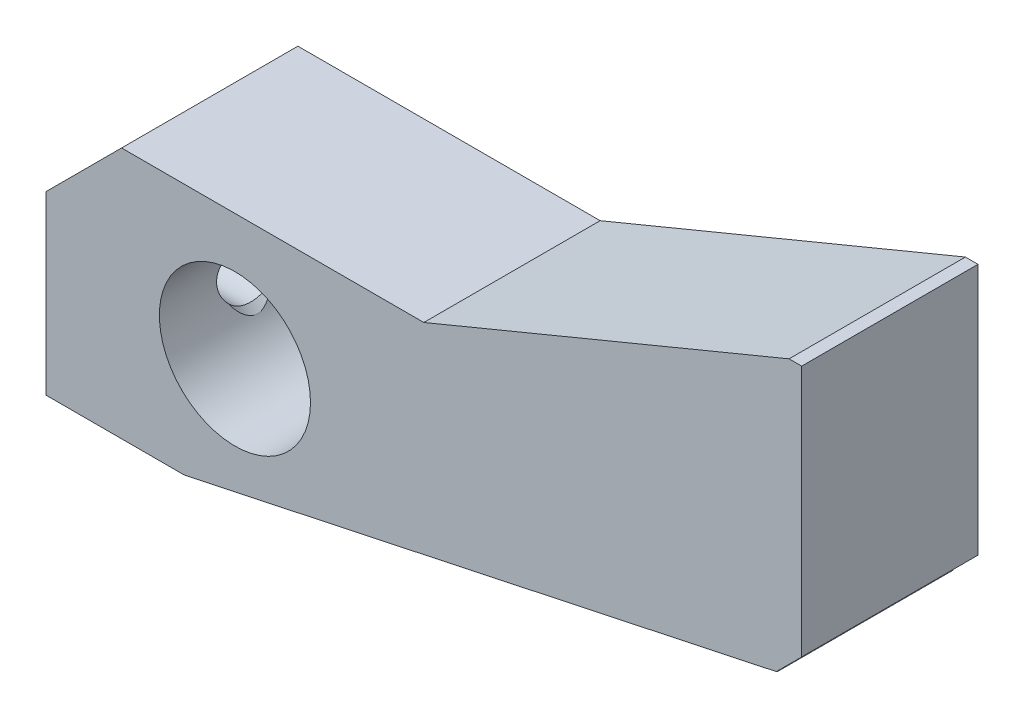
ISO-10303-21;
HEADER;
FILE_DESCRIPTION(('STEP AP214'),'2;1');
FILE_NAME('part.step','',(''),(''),'','','');
FILE_SCHEMA(('AUTOMOTIVE_DESIGN { 1 0 10303 214 1 1 1 1 }'));
ENDSEC;
DATA;
#1=APPLICATION_CONTEXT('core data for automotive mechanical design processes');
#2=APPLICATION_PROTOCOL_DEFINITION('international standard','automotive_design',2000,#1);
#3=PRODUCT_CONTEXT('',#1,'mechanical');
#4=PRODUCT('Part','Part','',(#3));
#5=PRODUCT_RELATED_PRODUCT_CATEGORY('part','',(#4));
#6=PRODUCT_DEFINITION_FORMATION('','',#4);
#7=PRODUCT_DEFINITION_CONTEXT('part definition',#1,'design');
#8=PRODUCT_DEFINITION('design','',#6,#7);
#9=PRODUCT_DEFINITION_SHAPE('','',#8);
#10=(LENGTH_UNIT() NAMED_UNIT(*) SI_UNIT(.MILLI.,.METRE.));
#11=(NAMED_UNIT(*) PLANE_ANGLE_UNIT() SI_UNIT($,.RADIAN.));
#12=(NAMED_UNIT(*) SI_UNIT($,.STERADIAN.) SOLID_ANGLE_UNIT());
#13=UNCERTAINTY_MEASURE_WITH_UNIT(LENGTH_MEASURE(1.E-05),#10,'distance_accuracy_value','');
#14=(GEOMETRIC_REPRESENTATION_CONTEXT(3) GLOBAL_UNCERTAINTY_ASSIGNED_CONTEXT((#13)) GLOBAL_UNIT_ASSIGNED_CONTEXT((#10,
#11,#12)) REPRESENTATION_CONTEXT('',''));
#15=CARTESIAN_POINT('',(0.,0.,0.));
#16=DIRECTION('',(0.,0.,1.));
#17=DIRECTION('',(1.,0.,0.));
#18=AXIS2_PLACEMENT_3D('',#15,#16,#17);
#19=CARTESIAN_POINT('',(7.5,23.,3.5));
#20=DIRECTION('',(0.,0.,-1.));
#21=DIRECTION('',(-1.,0.,0.));
#22=AXIS2_PLACEMENT_3D('',#19,#20,#21);
#23=CYLINDRICAL_SURFACE('',#22,3.);
#24=CARTESIAN_POINT('',(7.5,23.,3.5));
#25=DIRECTION('',(0.,0.,1.));
#26=DIRECTION('',(1.,0.,0.));
#27=AXIS2_PLACEMENT_3D('',#24,#25,#26);
#28=CIRCLE('',#27,3.);
#29=CARTESIAN_POINT('',(10.5,23.,3.5));
#30=VERTEX_POINT('',#29);
#31=EDGE_CURVE('E242',#30,#30,#28,.T.);
#32=ORIENTED_EDGE('',*,*,#31,.T.);
#33=EDGE_LOOP('',(#32));
#34=FACE_BOUND('',#33,.T.);
#35=CARTESIAN_POINT('',(7.5,23.,-3.5));
#36=DIRECTION('',(0.,0.,1.));
#37=DIRECTION('',(1.,0.,0.));
#38=AXIS2_PLACEMENT_3D('',#35,#36,#37);
#39=CIRCLE('',#38,3.);
#40=CARTESIAN_POINT('',(10.5,23.,-3.5));
#41=VERTEX_POINT('',#40);
#42=EDGE_CURVE('E137',#41,#41,#39,.T.);
#43=ORIENTED_EDGE('',*,*,#42,.F.);
#44=EDGE_LOOP('',(#43));
#45=FACE_BOUND('',#44,.T.);
#46=CARTESIAN_POINT('',(4.6041737886467,22.2162968970081,-0.911709662590456));
#47=CARTESIAN_POINT('',(4.61561035443615,22.1740121646667,-0.890437308156216));
#48=CARTESIAN_POINT('',(4.62777976627562,22.1327435841244,-0.867544293755267));
#49=CARTESIAN_POINT('',(4.65326943203076,22.052428132703,-0.818553624243152));
#50=CARTESIAN_POINT('',(4.6665915624406,22.0133850627965,-0.792450713553859));
#51=CARTESIAN_POINT('',(4.69418679658169,21.9374249658215,-0.736835309920441));
#52=CARTESIAN_POINT('',(4.70846895169041,21.9005369784616,-0.707287593652195));
#53=CARTESIAN_POINT('',(4.73739220776841,21.8297622128398,-0.645004540393534));
#54=CARTESIAN_POINT('',(4.75203296387119,21.7958726852927,-0.612272182461936));
#55=CARTESIAN_POINT('',(4.78147097347512,21.7307851376176,-0.542545419442342));
#56=CARTESIAN_POINT('',(4.79626280289275,21.6996769959314,-0.505464082449305));
#57=CARTESIAN_POINT('',(4.82467389714939,21.6421886882559,-0.427441648137738));
#58=CARTESIAN_POINT('',(4.83829582880437,21.6157976124887,-0.386509800357217));
#59=CARTESIAN_POINT('',(4.86008905224707,21.5747697156954,-0.310307068318638));
#60=CARTESIAN_POINT('',(4.86879303526547,21.558825675972,-0.275905168252087));
#61=CARTESIAN_POINT('',(4.88367474394825,21.5319810348952,-0.204673165274961));
#62=CARTESIAN_POINT('',(4.88985839417165,21.5210685977,-0.167848996067642));
#63=CARTESIAN_POINT('',(4.89787304701743,21.5070198254119,-0.0992698954484695));
#64=CARTESIAN_POINT('',(4.90028930554651,21.5028335014439,-0.0678038647716034));
#65=CARTESIAN_POINT('',(4.90236837955414,21.4992283970243,-0.00450936919528316));
#66=CARTESIAN_POINT('',(4.90203260692705,21.4998071719003,0.0273189014925282));
#67=CARTESIAN_POINT('',(4.89867009581343,21.5056465146143,0.0902949531264951));
#68=CARTESIAN_POINT('',(4.89565027539462,21.5108950463038,0.121444272721741));
#69=CARTESIAN_POINT('',(4.88736790271108,21.52547530725,0.182458333808734));
#70=CARTESIAN_POINT('',(4.88210266250033,21.5348119306364,0.212321488333723));
#71=CARTESIAN_POINT('',(4.86624474110431,21.5634305030651,0.28789738946331));
#72=CARTESIAN_POINT('',(4.8543525829973,21.5853165502174,0.33233904799125));
#73=CARTESIAN_POINT('',(4.82832684139246,21.6350967975101,0.417041314302471));
#74=CARTESIAN_POINT('',(4.81418461772468,21.6630143125327,0.457284772431448));
#75=CARTESIAN_POINT('',(4.77505897504597,21.743875805831,0.560178869743622));
#76=CARTESIAN_POINT('',(4.74927731935339,21.80087555344,0.619325510294756));
#77=CARTESIAN_POINT('',(4.69892340683024,21.9237069467362,0.72792308916227));
#78=CARTESIAN_POINT('',(4.67435068501032,21.9895351598729,0.777377777455286));
#79=CARTESIAN_POINT('',(4.64304628650006,22.0842863218241,0.838265690284918));
#80=CARTESIAN_POINT('',(4.63489242848784,22.1101056101497,0.853903872742624));
#81=CARTESIAN_POINT('',(4.61912042442353,22.1625751615868,0.883818247801013));
#82=CARTESIAN_POINT('',(4.6115008125624,22.1892228361823,0.898098208736462));
#83=CARTESIAN_POINT('',(4.6041737886467,22.2162968970081,0.911709662590457));
#84=B_SPLINE_CURVE_WITH_KNOTS('',3,(#46,#47,#48,#49,#50,#51,#52,#53,#54,#55,#56,#57,#58,#59,#60,
#61,#62,#63,#64,#65,#66,#67,#68,#69,#70,#71,#72,#73,#74,#75,#76,#77,#78,#79,#80,#81,#82,#83),
.UNSPECIFIED.,.F.,.F.,(4,2,2,2,2,2,2,2,2,2,2,2,2,2,2,2,2,2,4),(0.,0.146042119765071,
0.292326620834533,0.440265596049056,0.588067489177065,0.739611820685571,0.89080098779241,
1.007151161269,1.12322623008572,1.21829120325993,1.31330740762055,1.40807941794629,
1.50296519777145,1.65492506347748,1.80748319561722,2.06440215102411,2.32122150312435,
2.4149884981416,2.50848724897311),.UNSPECIFIED.);
#85=CARTESIAN_POINT('',(4.6314237886467,22.1217799138838,-0.860464833878788));
#86=VERTEX_POINT('',#85);
#87=CARTESIAN_POINT('',(4.6314237886467,22.1217799138838,0.860464833878788));
#88=VERTEX_POINT('',#87);
#89=EDGE_CURVE('E132',#86,#88,#84,.T.);
#90=ORIENTED_EDGE('',*,*,#89,.T.);
#91=CARTESIAN_POINT('',(4.6314237886467,22.1217799138838,0.860464833878788));
#92=CARTESIAN_POINT('',(4.61679684502925,22.1694296785405,0.909143753780978));
#93=CARTESIAN_POINT('',(4.60227727565843,22.2212145743478,0.953862536992754));
#94=CARTESIAN_POINT('',(4.57479980097877,22.331868584207,1.03438105606352));
#95=CARTESIAN_POINT('',(4.56184579496756,22.3907546854609,1.07015874981223));
#96=CARTESIAN_POINT('',(4.53890734778454,22.5143085241053,1.13161200365721));
#97=CARTESIAN_POINT('',(4.52892917135664,22.5789880911334,1.15726628801592));
#98=CARTESIAN_POINT('',(4.51309299584847,22.7121394275163,1.19734213641833));
#99=CARTESIAN_POINT('',(4.50722891348275,22.7806054356485,1.2117802885481));
#100=CARTESIAN_POINT('',(4.50045884641195,22.9157403646578,1.22840153249424));
#101=CARTESIAN_POINT('',(4.49931818644367,22.9823263144167,1.23116481981088));
#102=CARTESIAN_POINT('',(4.5014712897722,23.1150034920026,1.22590821709604));
#103=CARTESIAN_POINT('',(4.50476520635264,23.1810947026491,1.21788795432514));
#104=CARTESIAN_POINT('',(4.51524974660488,23.3085820040413,1.19186359028077));
#105=CARTESIAN_POINT('',(4.52230433517397,23.3700613144474,1.17420754478143));
#106=CARTESIAN_POINT('',(4.53954116712073,23.4891948576273,1.12978026633704));
#107=CARTESIAN_POINT('',(4.54972524174725,23.5468468267125,1.10300369543138));
#108=CARTESIAN_POINT('',(4.57145559791989,23.6529459422296,1.04343515557052));
#109=CARTESIAN_POINT('',(4.5828463171941,23.7017582994895,1.01123144465478));
#110=CARTESIAN_POINT('',(4.60661166069776,23.794103095026,0.940454921701907));
#111=CARTESIAN_POINT('',(4.61898431797601,23.8376456683954,0.901894683591802));
#112=CARTESIAN_POINT('',(4.6314237886467,23.8782200861162,0.860464833878787));
#113=B_SPLINE_CURVE_WITH_KNOTS('',3,(#91,#92,#93,#94,#95,#96,#97,#98,#99,#100,#101,#102,#103,
#104,#105,#106,#107,#108,#109,#110,#111,#112),.UNSPECIFIED.,.F.,.F.,(4,2,2,2,2,2,2,2,2,2,4),(0.,
0.20885179204027,0.418213488667532,0.628012873726244,0.837501382362083,1.03644688269537,
1.23539925986755,1.427599844071,1.61991311115374,1.79806290742298,1.97586444138595),.UNSPECIFIED.);
#114=CARTESIAN_POINT('',(4.6314237886467,23.8782200861162,0.860464833878788));
#115=VERTEX_POINT('',#114);
#116=EDGE_CURVE('E11',#88,#115,#113,.T.);
#117=ORIENTED_EDGE('',*,*,#116,.T.);
#118=CARTESIAN_POINT('',(4.6041737886467,23.7837031029919,0.911709662590456));
#119=CARTESIAN_POINT('',(4.61561035443615,23.8259878353333,0.890437308156215));
#120=CARTESIAN_POINT('',(4.62777976627562,23.8672564158756,0.867544293755266));
#121=CARTESIAN_POINT('',(4.65326943203076,23.947571867297,0.818553624243152));
#122=CARTESIAN_POINT('',(4.6665915624406,23.9866149372035,0.792450713553859));
#123=CARTESIAN_POINT('',(4.69418679658169,24.0625750341785,0.736835309920441));
#124=CARTESIAN_POINT('',(4.70846895169041,24.0994630215384,0.707287593652193));
#125=CARTESIAN_POINT('',(4.73739220776841,24.1702377871602,0.645004540393532));
#126=CARTESIAN_POINT('',(4.75203296387119,24.2041273147073,0.612272182461935));
#127=CARTESIAN_POINT('',(4.78147097347512,24.2692148623824,0.542545419442342));
#128=CARTESIAN_POINT('',(4.79626280289275,24.3003230040686,0.505464082449305));
#129=CARTESIAN_POINT('',(4.82467389714939,24.3578113117441,0.427441648137738));
#130=CARTESIAN_POINT('',(4.83829582880437,24.3842023875113,0.386509800357216));
#131=CARTESIAN_POINT('',(4.86008905224707,24.4252302843046,0.310307068318638));
#132=CARTESIAN_POINT('',(4.86879303526547,24.441174324028,0.275905168252088));
#133=CARTESIAN_POINT('',(4.88367474394825,24.4680189651048,0.204673165274962));
#134=CARTESIAN_POINT('',(4.88985839417165,24.4789314023,0.167848996067643));
#135=CARTESIAN_POINT('',(4.89787304701743,24.4929801745881,0.0992698954484706));
#136=CARTESIAN_POINT('',(4.90028930554651,24.4971664985561,0.0678038647716046));
#137=CARTESIAN_POINT('',(4.90236837955414,24.5007716029757,0.00450936919528443));
#138=CARTESIAN_POINT('',(4.90203260692705,24.5001928280997,-0.027318901492527));
#139=CARTESIAN_POINT('',(4.89867009581343,24.4943534853857,-0.0902949531264939));
#140=CARTESIAN_POINT('',(4.89565027539462,24.4891049536962,-0.12144427272174));
#141=CARTESIAN_POINT('',(4.88736790271108,24.47452469275,-0.182458333808733));
#142=CARTESIAN_POINT('',(4.88210266250033,24.4651880693636,-0.212321488333722));
#143=CARTESIAN_POINT('',(4.86624474110431,24.4365694969349,-0.287897389463308));
#144=CARTESIAN_POINT('',(4.85435258299731,24.4146834497826,-0.332339047991247));
#145=CARTESIAN_POINT('',(4.82832684139246,24.3649032024899,-0.417041314302468));
#146=CARTESIAN_POINT('',(4.81418461772468,24.3369856874673,-0.457284772431447));
#147=CARTESIAN_POINT('',(4.77505897504597,24.256124194169,-0.560178869743623));
#148=CARTESIAN_POINT('',(4.74927731935339,24.19912444656,-0.619325510294757));
#149=CARTESIAN_POINT('',(4.69892340683024,24.0762930532638,-0.72792308916227));
#150=CARTESIAN_POINT('',(4.67435068501032,24.0104648401271,-0.777377777455285));
#151=CARTESIAN_POINT('',(4.64304628650006,23.9157136781759,-0.838265690284916));
#152=CARTESIAN_POINT('',(4.63489242848784,23.8898943898503,-0.853903872742622));
#153=CARTESIAN_POINT('',(4.61912042442353,23.8374248384132,-0.883818247801011));
#154=CARTESIAN_POINT('',(4.6115008125624,23.8107771638177,-0.898098208736461));
#155=CARTESIAN_POINT('',(4.6041737886467,23.7837031029919,-0.911709662590456));
#156=B_SPLINE_CURVE_WITH_KNOTS('',3,(#118,#119,#120,#121,#122,#123,#124,#125,#126,#127,#128,
#129,#130,#131,#132,#133,#134,#135,#136,#137,#138,#139,#140,#141,#142,#143,#144,#145,#146,#147,
#148,#149,#150,#151,#152,#153,#154,#155),.UNSPECIFIED.,.F.,.F.,(4,2,2,2,2,2,2,2,2,2,2,2,2,2,2,2,
2,2,4),(0.,0.146042119765071,0.292326620834533,0.440265596049057,0.588067489177064,
0.739611820685571,0.890800987792409,1.007151161269,1.12322623008572,1.21829120325993,
1.31330740762055,1.40807941794629,1.50296519777145,1.65492506347748,1.80748319561721,
2.06440215102411,2.32122150312434,2.41498849814159,2.50848724897311),.UNSPECIFIED.);
#157=CARTESIAN_POINT('',(4.6314237886467,23.8782200861162,-0.860464833878788));
#158=VERTEX_POINT('',#157);
#159=EDGE_CURVE('E43',#115,#158,#156,.T.);
#160=ORIENTED_EDGE('',*,*,#159,.T.);
#161=CARTESIAN_POINT('',(4.6314237886467,23.8782200861162,-0.860464833878788));
#162=CARTESIAN_POINT('',(4.61679684502925,23.8305703214595,-0.909143753780978));
#163=CARTESIAN_POINT('',(4.60227727565843,23.7787854256522,-0.953862536992754));
#164=CARTESIAN_POINT('',(4.57479980097877,23.668131415793,-1.03438105606352));
#165=CARTESIAN_POINT('',(4.56184579496756,23.6092453145391,-1.07015874981223));
#166=CARTESIAN_POINT('',(4.53890734778454,23.4856914758947,-1.13161200365721));
#167=CARTESIAN_POINT('',(4.52892917135664,23.4210119088666,-1.15726628801592));
#168=CARTESIAN_POINT('',(4.51309299584847,23.2878605724837,-1.19734213641833));
#169=CARTESIAN_POINT('',(4.50722891348275,23.2193945643515,-1.2117802885481));
#170=CARTESIAN_POINT('',(4.50045884641195,23.0842596353422,-1.22840153249424));
#171=CARTESIAN_POINT('',(4.49931818644367,23.0176736855833,-1.23116481981088));
#172=CARTESIAN_POINT('',(4.5014712897722,22.8849965079974,-1.22590821709604));
#173=CARTESIAN_POINT('',(4.50476520635264,22.8189052973509,-1.21788795432514));
#174=CARTESIAN_POINT('',(4.51524974660488,22.6914179959587,-1.19186359028077));
#175=CARTESIAN_POINT('',(4.52230433517397,22.6299386855526,-1.17420754478143));
#176=CARTESIAN_POINT('',(4.53954116712073,22.5108051423727,-1.12978026633704));
#177=CARTESIAN_POINT('',(4.54972524174725,22.4531531732875,-1.10300369543138));
#178=CARTESIAN_POINT('',(4.57145559791989,22.3470540577704,-1.04343515557052));
#179=CARTESIAN_POINT('',(4.5828463171941,22.2982417005105,-1.01123144465478));
#180=CARTESIAN_POINT('',(4.60661166069776,22.205896904974,-0.940454921701907));
#181=CARTESIAN_POINT('',(4.61898431797601,22.1623543316046,-0.901894683591802));
#182=CARTESIAN_POINT('',(4.6314237886467,22.1217799138838,-0.860464833878787));
#183=B_SPLINE_CURVE_WITH_KNOTS('',3,(#161,#162,#163,#164,#165,#166,#167,#168,#169,#170,#171,
#172,#173,#174,#175,#176,#177,#178,#179,#180,#181,#182),.UNSPECIFIED.,.F.,.F.,(4,2,2,2,2,2,2,2,
2,2,4),(0.,0.20885179204027,0.418213488667532,0.628012873726248,0.837501382362083,
1.03644688269537,1.23539925986755,1.427599844071,1.61991311115374,1.79806290742298,
1.97586444138595),.UNSPECIFIED.);
#184=EDGE_CURVE('E125',#158,#86,#183,.T.);
#185=ORIENTED_EDGE('',*,*,#184,.T.);
#186=EDGE_LOOP('',(#90,#117,#160,#185));
#187=FACE_BOUND('',#186,.T.);
#188=ADVANCED_FACE('F34',(#34,#45,#187),#23,.F.);
#189=CARTESIAN_POINT('',(3.,28.,3.5));
#190=DIRECTION('',(0.707106781186547,-0.707106781186548,0.));
#191=DIRECTION('',(0.707106781186548,0.707106781186547,0.));
#192=AXIS2_PLACEMENT_3D('',#189,#190,#191);
#193=PLANE('',#192);
#194=DIRECTION('',(0.,0.,-1.));
#195=VECTOR('',#194,1.);
#196=CARTESIAN_POINT('',(3.,28.,3.5));
#197=LINE('',#196,#195);
#198=CARTESIAN_POINT('',(3.,28.,3.5));
#199=VERTEX_POINT('',#198);
#200=CARTESIAN_POINT('',(3.,28.,-3.5));
#201=VERTEX_POINT('',#200);
#202=EDGE_CURVE('E191',#199,#201,#197,.T.);
#203=ORIENTED_EDGE('',*,*,#202,.T.);
#204=DIRECTION('',(-0.707106781186548,-0.707106781186547,0.));
#205=VECTOR('',#204,1.);
#206=CARTESIAN_POINT('',(3.,28.,-3.5));
#207=LINE('',#206,#205);
#208=CARTESIAN_POINT('',(0.,25.,-3.5));
#209=VERTEX_POINT('',#208);
#210=EDGE_CURVE('E239',#201,#209,#207,.T.);
#211=ORIENTED_EDGE('',*,*,#210,.T.);
#212=DIRECTION('',(0.,0.,-1.));
#213=VECTOR('',#212,1.);
#214=CARTESIAN_POINT('',(0.,25.,3.5));
#215=LINE('',#214,#213);
#216=CARTESIAN_POINT('',(0.,25.,3.5));
#217=VERTEX_POINT('',#216);
#218=EDGE_CURVE('E133',#217,#209,#215,.T.);
#219=ORIENTED_EDGE('',*,*,#218,.F.);
#220=DIRECTION('',(-0.707106781186548,-0.707106781186547,0.));
#221=VECTOR('',#220,1.);
#222=CARTESIAN_POINT('',(3.,28.,3.5));
#223=LINE('',#222,#221);
#224=EDGE_CURVE('E210',#199,#217,#223,.T.);
#225=ORIENTED_EDGE('',*,*,#224,.F.);
#226=EDGE_LOOP('',(#203,#211,#219,#225));
#227=FACE_BOUND('',#226,.T.);
#228=ADVANCED_FACE('F36',(#227),#193,.F.);
#229=CARTESIAN_POINT('',(0.,25.,3.5));
#230=DIRECTION('',(1.,0.,0.));
#231=DIRECTION('',(0.,0.,-1.));
#232=AXIS2_PLACEMENT_3D('',#229,#230,#231);
#233=PLANE('',#232);
#234=CARTESIAN_POINT('',(0.,23.,0.));
#235=DIRECTION('',(1.,0.,0.));
#236=DIRECTION('',(0.,0.,-1.));
#237=AXIS2_PLACEMENT_3D('',#234,#235,#236);
#238=CIRCLE('',#237,1.5);
#239=CARTESIAN_POINT('',(0.,23.,-1.5));
#240=VERTEX_POINT('',#239);
#241=EDGE_CURVE('E250',#240,#240,#238,.T.);
#242=ORIENTED_EDGE('',*,*,#241,.T.);
#243=EDGE_LOOP('',(#242));
#244=FACE_BOUND('',#243,.T.);
#245=ORIENTED_EDGE('',*,*,#218,.T.);
#246=DIRECTION('',(0.,-1.,0.));
#247=VECTOR('',#246,1.);
#248=CARTESIAN_POINT('',(0.,25.,-3.5));
#249=LINE('',#248,#247);
#250=CARTESIAN_POINT('',(0.,18.,-3.5));
#251=VERTEX_POINT('',#250);
#252=EDGE_CURVE('E236',#209,#251,#249,.T.);
#253=ORIENTED_EDGE('',*,*,#252,.T.);
#254=DIRECTION('',(0.,0.,-1.));
#255=VECTOR('',#254,1.);
#256=CARTESIAN_POINT('',(0.,18.,3.5));
#257=LINE('',#256,#255);
#258=CARTESIAN_POINT('',(0.,18.,3.5));
#259=VERTEX_POINT('',#258);
#260=EDGE_CURVE('E175',#259,#251,#257,.T.);
#261=ORIENTED_EDGE('',*,*,#260,.F.);
#262=DIRECTION('',(0.,-1.,0.));
#263=VECTOR('',#262,1.);
#264=CARTESIAN_POINT('',(0.,25.,3.5));
#265=LINE('',#264,#263);
#266=EDGE_CURVE('E208',#217,#259,#265,.T.);
#267=ORIENTED_EDGE('',*,*,#266,.F.);
#268=EDGE_LOOP('',(#245,#253,#261,#267));
#269=FACE_BOUND('',#268,.T.);
#270=ADVANCED_FACE('F278',(#244,#269),#233,.F.);
#271=CARTESIAN_POINT('',(0.,18.,3.5));
#272=DIRECTION('',(0.,1.,0.));
#273=DIRECTION('',(0.,0.,1.));
#274=AXIS2_PLACEMENT_3D('',#271,#272,#273);
#275=PLANE('',#274);
#276=ORIENTED_EDGE('',*,*,#260,.T.);
#277=DIRECTION('',(1.,0.,0.));
#278=VECTOR('',#277,1.);
#279=CARTESIAN_POINT('',(0.,18.,-3.5));
#280=LINE('',#279,#278);
#281=CARTESIAN_POINT('',(5.5,18.,-3.5));
#282=VERTEX_POINT('',#281);
#283=EDGE_CURVE('E233',#251,#282,#280,.T.);
#284=ORIENTED_EDGE('',*,*,#283,.T.);
#285=DIRECTION('',(0.,0.,-1.));
#286=VECTOR('',#285,1.);
#287=CARTESIAN_POINT('',(5.5,18.,3.5));
#288=LINE('',#287,#286);
#289=CARTESIAN_POINT('',(5.5,18.,3.5));
#290=VERTEX_POINT('',#289);
#291=EDGE_CURVE('E177',#290,#282,#288,.T.);
#292=ORIENTED_EDGE('',*,*,#291,.F.);
#293=DIRECTION('',(1.,0.,0.));
#294=VECTOR('',#293,1.);
#295=CARTESIAN_POINT('',(0.,18.,3.5));
#296=LINE('',#295,#294);
#297=EDGE_CURVE('E206',#259,#290,#296,.T.);
#298=ORIENTED_EDGE('',*,*,#297,.F.);
#299=EDGE_LOOP('',(#276,#284,#292,#298));
#300=FACE_BOUND('',#299,.T.);
#301=ADVANCED_FACE('F329',(#300),#275,.F.);
#302=CARTESIAN_POINT('',(5.5,18.,3.5));
#303=DIRECTION('',(-0.207911690817762,0.978147600733805,0.));
#304=DIRECTION('',(-0.978147600733805,-0.207911690817762,0.));
#305=AXIS2_PLACEMENT_3D('',#302,#303,#304);
#306=PLANE('',#305);
#307=CARTESIAN_POINT('',(23.7873043968524,21.8870865448081,0.));
#308=DIRECTION('',(-0.207911690817762,0.978147600733805,0.));
#309=DIRECTION('',(-0.978147600733805,-0.207911690817762,0.));
#310=AXIS2_PLACEMENT_3D('',#307,#308,#309);
#311=CIRCLE('',#310,3.207106781187);
#312=CARTESIAN_POINT('',(20.6502805935372,21.2202915512984,0.));
#313=VERTEX_POINT('',#312);
#314=EDGE_CURVE('E38',#313,#313,#311,.F.);
#315=ORIENTED_EDGE('',*,*,#314,.F.);
#316=EDGE_LOOP('',(#315));
#317=FACE_BOUND('',#316,.T.);
#318=ORIENTED_EDGE('',*,*,#291,.T.);
#319=DIRECTION('',(0.978147600733805,0.207911690817762,0.));
#320=VECTOR('',#319,1.);
#321=CARTESIAN_POINT('',(5.5,18.,-3.5));
#322=LINE('',#321,#320);
#323=CARTESIAN_POINT('',(29.023150547392,23.,-3.5));
#324=VERTEX_POINT('',#323);
#325=EDGE_CURVE('E230',#282,#324,#322,.T.);
#326=ORIENTED_EDGE('',*,*,#325,.T.);
#327=DIRECTION('',(0.,0.,-1.));
#328=VECTOR('',#327,1.);
#329=CARTESIAN_POINT('',(29.023150547392,23.,3.5));
#330=LINE('',#329,#328);
#331=CARTESIAN_POINT('',(29.023150547392,23.,3.5));
#332=VERTEX_POINT('',#331);
#333=EDGE_CURVE('E179',#332,#324,#330,.T.);
#334=ORIENTED_EDGE('',*,*,#333,.F.);
#335=DIRECTION('',(0.978147600733805,0.207911690817762,0.));
#336=VECTOR('',#335,1.);
#337=CARTESIAN_POINT('',(5.5,18.,3.5));
#338=LINE('',#337,#336);
#339=EDGE_CURVE('E204',#290,#332,#338,.T.);
#340=ORIENTED_EDGE('',*,*,#339,.F.);
#341=EDGE_LOOP('',(#318,#326,#334,#340));
#342=FACE_BOUND('',#341,.T.);
#343=ADVANCED_FACE('F324',(#317,#342),#306,.F.);
#344=CARTESIAN_POINT('',(29.023150547392,23.,3.5));
#345=DIRECTION('',(0.,-1.,0.));
#346=DIRECTION('',(0.,0.,-1.));
#347=AXIS2_PLACEMENT_3D('',#344,#345,#346);
#348=PLANE('',#347);
#349=ORIENTED_EDGE('',*,*,#333,.T.);
#350=DIRECTION('',(-1.,0.,0.));
#351=VECTOR('',#350,1.);
#352=CARTESIAN_POINT('',(29.023150547392,23.,-3.5));
#353=LINE('',#352,#351);
#354=CARTESIAN_POINT('',(29.,23.,-3.5));
#355=VERTEX_POINT('',#354);
#356=EDGE_CURVE('E227',#324,#355,#353,.T.);
#357=ORIENTED_EDGE('',*,*,#356,.T.);
#358=DIRECTION('',(0.,0.,-1.));
#359=VECTOR('',#358,1.);
#360=CARTESIAN_POINT('',(29.,23.,3.5));
#361=LINE('',#360,#359);
#362=CARTESIAN_POINT('',(29.,23.,3.5));
#363=VERTEX_POINT('',#362);
#364=EDGE_CURVE('E181',#363,#355,#361,.T.);
#365=ORIENTED_EDGE('',*,*,#364,.F.);
#366=DIRECTION('',(-1.,0.,0.));
#367=VECTOR('',#366,1.);
#368=CARTESIAN_POINT('',(29.023150547392,23.,3.5));
#369=LINE('',#368,#367);
#370=EDGE_CURVE('E202',#332,#363,#369,.T.);
#371=ORIENTED_EDGE('',*,*,#370,.F.);
#372=EDGE_LOOP('',(#349,#357,#365,#371));
#373=FACE_BOUND('',#372,.T.);
#374=ADVANCED_FACE('F320',(#373),#348,.F.);
#375=CARTESIAN_POINT('',(29.,23.,3.5));
#376=DIRECTION('',(-0.707106781186549,0.707106781186546,0.));
#377=DIRECTION('',(-0.707106781186546,-0.707106781186549,0.));
#378=AXIS2_PLACEMENT_3D('',#375,#376,#377);
#379=PLANE('',#378);
#380=ORIENTED_EDGE('',*,*,#364,.T.);
#381=DIRECTION('',(0.707106781186546,0.707106781186549,0.));
#382=VECTOR('',#381,1.);
#383=CARTESIAN_POINT('',(29.,23.,-3.5));
#384=LINE('',#383,#382);
#385=CARTESIAN_POINT('',(30.,24.,-3.5));
#386=VERTEX_POINT('',#385);
#387=EDGE_CURVE('E224',#355,#386,#384,.T.);
#388=ORIENTED_EDGE('',*,*,#387,.T.);
#389=DIRECTION('',(0.,0.,-1.));
#390=VECTOR('',#389,1.);
#391=CARTESIAN_POINT('',(30.,24.,3.5));
#392=LINE('',#391,#390);
#393=CARTESIAN_POINT('',(30.,24.,3.5));
#394=VERTEX_POINT('',#393);
#395=EDGE_CURVE('E183',#394,#386,#392,.T.);
#396=ORIENTED_EDGE('',*,*,#395,.F.);
#397=DIRECTION('',(0.707106781186546,0.707106781186549,0.));
#398=VECTOR('',#397,1.);
#399=CARTESIAN_POINT('',(29.,23.,3.5));
#400=LINE('',#399,#398);
#401=EDGE_CURVE('E200',#363,#394,#400,.T.);
#402=ORIENTED_EDGE('',*,*,#401,.F.);
#403=EDGE_LOOP('',(#380,#388,#396,#402));
#404=FACE_BOUND('',#403,.T.);
#405=ADVANCED_FACE('F315',(#404),#379,.F.);
#406=CARTESIAN_POINT('',(30.,24.,3.5));
#407=DIRECTION('',(-1.,0.,0.));
#408=DIRECTION('',(0.,0.,1.));
#409=AXIS2_PLACEMENT_3D('',#406,#407,#408);
#410=PLANE('',#409);
#411=ORIENTED_EDGE('',*,*,#395,.T.);
#412=DIRECTION('',(0.,1.,0.));
#413=VECTOR('',#412,1.);
#414=CARTESIAN_POINT('',(30.,24.,-3.5));
#415=LINE('',#414,#413);
#416=CARTESIAN_POINT('',(30.,34.,-3.5));
#417=VERTEX_POINT('',#416);
#418=EDGE_CURVE('E221',#386,#417,#415,.T.);
#419=ORIENTED_EDGE('',*,*,#418,.T.);
#420=DIRECTION('',(0.,0.,-1.));
#421=VECTOR('',#420,1.);
#422=CARTESIAN_POINT('',(30.,34.,3.5));
#423=LINE('',#422,#421);
#424=CARTESIAN_POINT('',(30.,34.,3.5));
#425=VERTEX_POINT('',#424);
#426=EDGE_CURVE('E185',#425,#417,#423,.T.);
#427=ORIENTED_EDGE('',*,*,#426,.F.);
#428=DIRECTION('',(0.,1.,0.));
#429=VECTOR('',#428,1.);
#430=CARTESIAN_POINT('',(30.,24.,3.5));
#431=LINE('',#430,#429);
#432=EDGE_CURVE('E198',#394,#425,#431,.T.);
#433=ORIENTED_EDGE('',*,*,#432,.F.);
#434=EDGE_LOOP('',(#411,#419,#427,#433));
#435=FACE_BOUND('',#434,.T.);
#436=ADVANCED_FACE('F310',(#435),#410,.F.);
#437=CARTESIAN_POINT('',(30.,34.,3.5));
#438=DIRECTION('',(0.,-1.,0.));
#439=DIRECTION('',(0.,0.,-1.));
#440=AXIS2_PLACEMENT_3D('',#437,#438,#439);
#441=PLANE('',#440);
#442=ORIENTED_EDGE('',*,*,#426,.T.);
#443=DIRECTION('',(-1.,0.,0.));
#444=VECTOR('',#443,1.);
#445=CARTESIAN_POINT('',(30.,34.,-3.5));
#446=LINE('',#445,#444);
#447=CARTESIAN_POINT('',(29.5,34.,-3.5));
#448=VERTEX_POINT('',#447);
#449=EDGE_CURVE('E218',#417,#448,#446,.T.);
#450=ORIENTED_EDGE('',*,*,#449,.T.);
#451=DIRECTION('',(0.,0.,-1.));
#452=VECTOR('',#451,1.);
#453=CARTESIAN_POINT('',(29.5,34.,3.5));
#454=LINE('',#453,#452);
#455=CARTESIAN_POINT('',(29.5,34.,3.5));
#456=VERTEX_POINT('',#455);
#457=EDGE_CURVE('E187',#456,#448,#454,.T.);
#458=ORIENTED_EDGE('',*,*,#457,.F.);
#459=DIRECTION('',(-1.,0.,0.));
#460=VECTOR('',#459,1.);
#461=CARTESIAN_POINT('',(30.,34.,3.5));
#462=LINE('',#461,#460);
#463=EDGE_CURVE('E196',#425,#456,#462,.T.);
#464=ORIENTED_EDGE('',*,*,#463,.F.);
#465=EDGE_LOOP('',(#442,#450,#458,#464));
#466=FACE_BOUND('',#465,.T.);
#467=ADVANCED_FACE('F305',(#466),#441,.F.);
#468=CARTESIAN_POINT('',(29.5,34.,3.5));
#469=DIRECTION('',(0.3823517927263,-0.924016832421891,0.));
#470=DIRECTION('',(0.924016832421891,0.3823517927263,0.));
#471=AXIS2_PLACEMENT_3D('',#468,#469,#470);
#472=PLANE('',#471);
#473=ORIENTED_EDGE('',*,*,#457,.T.);
#474=DIRECTION('',(-0.924016832421891,-0.3823517927263,0.));
#475=VECTOR('',#474,1.);
#476=CARTESIAN_POINT('',(29.5,34.,-3.5));
#477=LINE('',#476,#475);
#478=CARTESIAN_POINT('',(15.,28.,-3.5));
#479=VERTEX_POINT('',#478);
#480=EDGE_CURVE('E215',#448,#479,#477,.T.);
#481=ORIENTED_EDGE('',*,*,#480,.T.);
#482=DIRECTION('',(0.,0.,-1.));
#483=VECTOR('',#482,1.);
#484=CARTESIAN_POINT('',(15.,28.,3.5));
#485=LINE('',#484,#483);
#486=CARTESIAN_POINT('',(15.,28.,3.5));
#487=VERTEX_POINT('',#486);
#488=EDGE_CURVE('E189',#487,#479,#485,.T.);
#489=ORIENTED_EDGE('',*,*,#488,.F.);
#490=DIRECTION('',(-0.924016832421891,-0.3823517927263,0.));
#491=VECTOR('',#490,1.);
#492=CARTESIAN_POINT('',(29.5,34.,3.5));
#493=LINE('',#492,#491);
#494=EDGE_CURVE('E194',#456,#487,#493,.T.);
#495=ORIENTED_EDGE('',*,*,#494,.F.);
#496=EDGE_LOOP('',(#473,#481,#489,#495));
#497=FACE_BOUND('',#496,.T.);
#498=ADVANCED_FACE('F300',(#497),#472,.F.);
#499=CARTESIAN_POINT('',(15.,28.,3.5));
#500=DIRECTION('',(0.,-1.,0.));
#501=DIRECTION('',(0.,0.,-1.));
#502=AXIS2_PLACEMENT_3D('',#499,#500,#501);
#503=PLANE('',#502);
#504=ORIENTED_EDGE('',*,*,#488,.T.);
#505=DIRECTION('',(-1.,0.,0.));
#506=VECTOR('',#505,1.);
#507=CARTESIAN_POINT('',(15.,28.,-3.5));
#508=LINE('',#507,#506);
#509=EDGE_CURVE('E212',#479,#201,#508,.T.);
#510=ORIENTED_EDGE('',*,*,#509,.T.);
#511=ORIENTED_EDGE('',*,*,#202,.F.);
#512=DIRECTION('',(-1.,0.,0.));
#513=VECTOR('',#512,1.);
#514=CARTESIAN_POINT('',(15.,28.,3.5));
#515=LINE('',#514,#513);
#516=EDGE_CURVE('E58',#487,#199,#515,.T.);
#517=ORIENTED_EDGE('',*,*,#516,.F.);
#518=EDGE_LOOP('',(#504,#510,#511,#517));
#519=FACE_BOUND('',#518,.T.);
#520=ADVANCED_FACE('F295',(#519),#503,.F.);
#521=CARTESIAN_POINT('',(0.,0.,3.5));
#522=DIRECTION('',(0.,0.,1.));
#523=DIRECTION('',(1.,0.,0.));
#524=AXIS2_PLACEMENT_3D('',#521,#522,#523);
#525=PLANE('',#524);
#526=ORIENTED_EDGE('',*,*,#31,.F.);
#527=EDGE_LOOP('',(#526));
#528=FACE_BOUND('',#527,.T.);
#529=ORIENTED_EDGE('',*,*,#224,.T.);
#530=ORIENTED_EDGE('',*,*,#266,.T.);
#531=ORIENTED_EDGE('',*,*,#297,.T.);
#532=ORIENTED_EDGE('',*,*,#339,.T.);
#533=ORIENTED_EDGE('',*,*,#370,.T.);
#534=ORIENTED_EDGE('',*,*,#401,.T.);
#535=ORIENTED_EDGE('',*,*,#432,.T.);
#536=ORIENTED_EDGE('',*,*,#463,.T.);
#537=ORIENTED_EDGE('',*,*,#494,.T.);
#538=ORIENTED_EDGE('',*,*,#516,.T.);
#539=EDGE_LOOP('',(#529,#530,#531,#532,#533,#534,#535,#536,#537,#538));
#540=FACE_BOUND('',#539,.T.);
#541=ADVANCED_FACE('F287',(#528,#540),#525,.T.);
#542=CARTESIAN_POINT('',(0.,0.,-3.5));
#543=DIRECTION('',(0.,0.,1.));
#544=DIRECTION('',(1.,0.,0.));
#545=AXIS2_PLACEMENT_3D('',#542,#543,#544);
#546=PLANE('',#545);
#547=ORIENTED_EDGE('',*,*,#42,.T.);
#548=EDGE_LOOP('',(#547));
#549=FACE_BOUND('',#548,.T.);
#550=ORIENTED_EDGE('',*,*,#210,.F.);
#551=ORIENTED_EDGE('',*,*,#509,.F.);
#552=ORIENTED_EDGE('',*,*,#480,.F.);
#553=ORIENTED_EDGE('',*,*,#449,.F.);
#554=ORIENTED_EDGE('',*,*,#418,.F.);
#555=ORIENTED_EDGE('',*,*,#387,.F.);
#556=ORIENTED_EDGE('',*,*,#356,.F.);
#557=ORIENTED_EDGE('',*,*,#325,.F.);
#558=ORIENTED_EDGE('',*,*,#283,.F.);
#559=ORIENTED_EDGE('',*,*,#252,.F.);
#560=EDGE_LOOP('',(#550,#551,#552,#553,#554,#555,#556,#557,#558,#559));
#561=FACE_BOUND('',#560,.T.);
#562=ADVANCED_FACE('F284',(#549,#561),#546,.F.);
#563=CARTESIAN_POINT('',(4.6314237886467,23.,0.));
#564=DIRECTION('',(1.,0.,0.));
#565=DIRECTION('',(0.,0.,-1.));
#566=AXIS2_PLACEMENT_3D('',#563,#564,#565);
#567=CONICAL_SURFACE('',#566,1.2295,0.785398163397455);
#568=CARTESIAN_POINT('',(4.6314237886467,23.,0.));
#569=DIRECTION('',(1.,0.,0.));
#570=DIRECTION('',(0.,0.,-1.));
#571=AXIS2_PLACEMENT_3D('',#568,#569,#570);
#572=CIRCLE('',#571,1.2295);
#573=EDGE_CURVE('E129',#158,#115,#572,.T.);
#574=ORIENTED_EDGE('',*,*,#573,.F.);
#575=ORIENTED_EDGE('',*,*,#159,.F.);
#576=EDGE_LOOP('',(#574,#575));
#577=FACE_BOUND('',#576,.T.);
#578=ADVANCED_FACE('F136',(#577),#567,.F.);
#579=EDGE_CURVE('E50',#88,#86,#572,.T.);
#580=ORIENTED_EDGE('',*,*,#579,.F.);
#581=ORIENTED_EDGE('',*,*,#89,.F.);
#582=EDGE_LOOP('',(#580,#581));
#583=FACE_BOUND('',#582,.T.);
#584=ADVANCED_FACE('F158',(#583),#567,.F.);
#585=CARTESIAN_POINT('',(0.,23.,0.));
#586=DIRECTION('',(1.,0.,0.));
#587=DIRECTION('',(0.,0.,-1.));
#588=AXIS2_PLACEMENT_3D('',#585,#586,#587);
#589=CYLINDRICAL_SURFACE('',#588,1.2295);
#590=ORIENTED_EDGE('',*,*,#579,.T.);
#591=ORIENTED_EDGE('',*,*,#184,.F.);
#592=ORIENTED_EDGE('',*,*,#573,.T.);
#593=ORIENTED_EDGE('',*,*,#116,.F.);
#594=EDGE_LOOP('',(#590,#591,#592,#593));
#595=FACE_BOUND('',#594,.T.);
#596=CARTESIAN_POINT('',(0.2705,23.,0.));
#597=DIRECTION('',(1.,0.,0.));
#598=DIRECTION('',(0.,0.,-1.));
#599=AXIS2_PLACEMENT_3D('',#596,#597,#598);
#600=CIRCLE('',#599,1.2295);
#601=CARTESIAN_POINT('',(0.2705,23.,-1.2295));
#602=VERTEX_POINT('',#601);
#603=EDGE_CURVE('E247',#602,#602,#600,.T.);
#604=ORIENTED_EDGE('',*,*,#603,.F.);
#605=EDGE_LOOP('',(#604));
#606=FACE_BOUND('',#605,.T.);
#607=ADVANCED_FACE('F127',(#595,#606),#589,.F.);
#608=CARTESIAN_POINT('',(0.,23.,0.));
#609=DIRECTION('',(-1.,0.,0.));
#610=DIRECTION('',(0.,0.,1.));
#611=AXIS2_PLACEMENT_3D('',#608,#609,#610);
#612=CONICAL_SURFACE('',#611,1.5,0.785398163397454);
#613=ORIENTED_EDGE('',*,*,#603,.T.);
#614=EDGE_LOOP('',(#613));
#615=FACE_BOUND('',#614,.T.);
#616=ORIENTED_EDGE('',*,*,#241,.F.);
#617=EDGE_LOOP('',(#616));
#618=FACE_BOUND('',#617,.T.);
#619=ADVANCED_FACE('F166',(#615,#618),#612,.F.);
#620=CARTESIAN_POINT('',(23.9672940243739,21.0403019237773,0.));
#621=DIRECTION('',(0.207911690817682,-0.978147600733822,0.));
#622=DIRECTION('',(0.978147600733822,0.207911690817682,0.));
#623=AXIS2_PLACEMENT_3D('',#620,#621,#622);
#624=CONICAL_SURFACE('',#623,4.07280907437419,0.78539816339743);
#625=CARTESIAN_POINT('',(23.6402886303874,22.5787413462888,0.));
#626=DIRECTION('',(-0.207911690817682,0.978147600733822,0.));
#627=DIRECTION('',(-0.978147600733822,-0.207911690817682,0.));
#628=AXIS2_PLACEMENT_3D('',#625,#626,#627);
#629=CIRCLE('',#628,2.50000000000004);
#630=CARTESIAN_POINT('',(21.194919628553,22.0589621192446,0.));
#631=VERTEX_POINT('',#630);
#632=EDGE_CURVE('E256',#631,#631,#629,.T.);
#633=ORIENTED_EDGE('',*,*,#632,.T.);
#634=EDGE_LOOP('',(#633));
#635=FACE_BOUND('',#634,.T.);
#636=ORIENTED_EDGE('',*,*,#314,.T.);
#637=EDGE_LOOP('',(#636));
#638=FACE_BOUND('',#637,.T.);
#639=ADVANCED_FACE('F260',(#635,#638),#624,.F.);
#640=CARTESIAN_POINT('',(22.9556576335819,25.7996769477434,0.));
#641=DIRECTION('',(0.207911690817682,-0.978147600733822,0.));
#642=DIRECTION('',(0.978147600733822,0.207911690817682,0.));
#643=AXIS2_PLACEMENT_3D('',#640,#641,#642);
#644=PLANE('',#643);
#645=CARTESIAN_POINT('',(22.9556576335818,25.7996769477439,0.));
#646=DIRECTION('',(-0.207911690817682,0.978147600733822,0.));
#647=DIRECTION('',(-0.978147600733822,-0.207911690817682,0.));
#648=AXIS2_PLACEMENT_3D('',#645,#646,#647);
#649=CIRCLE('',#648,2.49999999999962);
#650=CARTESIAN_POINT('',(20.5102886317474,25.2798977206997,0.));
#651=VERTEX_POINT('',#650);
#652=EDGE_CURVE('E253',#651,#651,#649,.T.);
#653=ORIENTED_EDGE('',*,*,#652,.F.);
#654=EDGE_LOOP('',(#653));
#655=FACE_BOUND('',#654,.T.);
#656=ADVANCED_FACE('F265',(#655),#644,.T.);
#657=CARTESIAN_POINT('',(23.967294024374,21.040301923777,0.));
#658=DIRECTION('',(-0.207911690817682,0.978147600733822,0.));
#659=DIRECTION('',(-0.978147600733822,-0.207911690817682,0.));
#660=AXIS2_PLACEMENT_3D('',#657,#658,#659);
#661=CYLINDRICAL_SURFACE('',#660,2.49999999999983);
#662=CARTESIAN_POINT('',(20.5102886317474,25.2798977206997,0.));
#663=CARTESIAN_POINT('',(20.5174202046308,25.2463463081845,0.));
#664=CARTESIAN_POINT('',(20.5245517775142,25.2127948956694,0.));
#665=CARTESIAN_POINT('',(20.538814923281,25.1456920706391,0.));
#666=CARTESIAN_POINT('',(20.5459464961644,25.1121406581239,0.));
#667=CARTESIAN_POINT('',(20.5602096419312,25.0450378330936,0.));
#668=CARTESIAN_POINT('',(20.5673412148146,25.0114864205784,0.));
#669=CARTESIAN_POINT('',(20.5816043605813,24.9443835955481,0.));
#670=CARTESIAN_POINT('',(20.5887359334647,24.910832183033,0.));
#671=CARTESIAN_POINT('',(20.6029990792315,24.8437293580027,0.));
#672=CARTESIAN_POINT('',(20.6101306521149,24.8101779454875,0.));
#673=CARTESIAN_POINT('',(20.6243937978817,24.7430751204572,0.));
#674=CARTESIAN_POINT('',(20.6315253707651,24.709523707942,0.));
#675=CARTESIAN_POINT('',(20.6457885165319,24.6424208829117,0.));
#676=CARTESIAN_POINT('',(20.6529200894153,24.6088694703966,0.));
#677=CARTESIAN_POINT('',(20.667183235182,24.5417666453662,0.));
#678=CARTESIAN_POINT('',(20.6743148080654,24.5082152328511,0.));
#679=CARTESIAN_POINT('',(20.6885779538322,24.4411124078208,0.));
#680=CARTESIAN_POINT('',(20.6957095267156,24.4075609953056,0.));
#681=CARTESIAN_POINT('',(20.7099726724824,24.3404581702753,0.));
#682=CARTESIAN_POINT('',(20.7171042453658,24.3069067577601,0.));
#683=CARTESIAN_POINT('',(20.7313673911326,24.2398039327298,0.));
#684=CARTESIAN_POINT('',(20.738498964016,24.2062525202147,0.));
#685=CARTESIAN_POINT('',(20.7527621097827,24.1391496951844,0.));
#686=CARTESIAN_POINT('',(20.7598936826661,24.1055982826692,0.));
#687=CARTESIAN_POINT('',(20.7741568284329,24.0384954576389,0.));
#688=CARTESIAN_POINT('',(20.7812884013163,24.0049440451237,0.));
#689=CARTESIAN_POINT('',(20.7955515470831,23.9378412200934,0.));
#690=CARTESIAN_POINT('',(20.8026831199665,23.9042898075783,0.));
#691=CARTESIAN_POINT('',(20.8169462657333,23.8371869825479,0.));
#692=CARTESIAN_POINT('',(20.8240778386167,23.8036355700328,0.));
#693=CARTESIAN_POINT('',(20.8383409843834,23.7365327450025,0.));
#694=CARTESIAN_POINT('',(20.8454725572668,23.7029813324873,0.));
#695=CARTESIAN_POINT('',(20.8597357030336,23.635878507457,0.));
#696=CARTESIAN_POINT('',(20.866867275917,23.6023270949418,0.));
#697=CARTESIAN_POINT('',(20.8811304216838,23.5352242699115,0.));
#698=CARTESIAN_POINT('',(20.8882619945672,23.5016728573964,0.));
#699=CARTESIAN_POINT('',(20.902525140334,23.4345700323661,0.));
#700=CARTESIAN_POINT('',(20.9096567132174,23.4010186198509,0.));
#701=CARTESIAN_POINT('',(20.9239198589841,23.3339157948206,0.));
#702=CARTESIAN_POINT('',(20.9310514318675,23.3003643823054,0.));
#703=CARTESIAN_POINT('',(20.9453145776343,23.2332615572751,0.));
#704=CARTESIAN_POINT('',(20.9524461505177,23.19971014476,0.));
#705=CARTESIAN_POINT('',(20.9667092962845,23.1326073197296,0.));
#706=CARTESIAN_POINT('',(20.9738408691679,23.0990559072145,0.));
#707=CARTESIAN_POINT('',(20.9881040149347,23.0319530821842,0.));
#708=CARTESIAN_POINT('',(20.9952355878181,22.998401669669,0.));
#709=CARTESIAN_POINT('',(21.0094987335848,22.9312988446387,0.));
#710=CARTESIAN_POINT('',(21.0166303064682,22.8977474321235,0.));
#711=CARTESIAN_POINT('',(21.030893452235,22.8306446070932,0.));
#712=CARTESIAN_POINT('',(21.0380250251184,22.7970931945781,0.));
#713=CARTESIAN_POINT('',(21.0522881708852,22.7299903695478,0.));
#714=CARTESIAN_POINT('',(21.0594197437686,22.6964389570326,0.));
#715=CARTESIAN_POINT('',(21.0736828895354,22.6293361320023,0.));
#716=CARTESIAN_POINT('',(21.0808144624188,22.5957847194871,0.));
#717=CARTESIAN_POINT('',(21.0950776081855,22.5286818944568,0.));
#718=CARTESIAN_POINT('',(21.1022091810689,22.4951304819417,0.));
#719=CARTESIAN_POINT('',(21.1164723268357,22.4280276569113,0.));
#720=CARTESIAN_POINT('',(21.1236038997191,22.3944762443962,0.));
#721=CARTESIAN_POINT('',(21.1378670454859,22.3273734193659,0.));
#722=CARTESIAN_POINT('',(21.1449986183693,22.2938220068507,0.));
#723=CARTESIAN_POINT('',(21.1592617641361,22.2267191818204,0.));
#724=CARTESIAN_POINT('',(21.1663933370195,22.1931677693052,0.));
#725=CARTESIAN_POINT('',(21.1806564827862,22.1260649442749,0.));
#726=CARTESIAN_POINT('',(21.1877880556696,22.0925135317598,0.));
#727=CARTESIAN_POINT('',(21.194919628553,22.0589621192446,0.));
#728=B_SPLINE_CURVE_WITH_KNOTS('',3,(#662,#663,#664,#665,#666,#667,#668,#669,#670,#671,#672,
#673,#674,#675,#676,#677,#678,#679,#680,#681,#682,#683,#684,#685,#686,#687,#688,#689,#690,#691,
#692,#693,#694,#695,#696,#697,#698,#699,#700,#701,#702,#703,#704,#705,#706,#707,#708,#709,#710,
#711,#712,#713,#714,#715,#716,#717,#718,#719,#720,#721,#722,#723,#724,#725,#726,#727),
.UNSPECIFIED.,.F.,.F.,(4,2,2,2,2,2,2,2,2,2,2,2,2,2,2,2,2,2,2,2,2,2,2,2,2,2,2,2,2,2,2,2,4),(0.,
0.102902913087922,0.205805826175843,0.308708739263765,0.411611652351687,0.514514565439608,
0.61741747852753,0.720320391615452,0.823223304703373,0.926126217791295,1.02902913087922,
1.13193204396714,1.23483495705506,1.33773787014298,1.4406407832309,1.54354369631882,
1.64644660940675,1.74934952249467,1.85225243558259,1.95515534867051,2.05805826175843,
2.16096117484635,2.26386408793427,2.3667670010222,2.46966991411012,2.57257282719804,
2.67547574028596,2.77837865337389,2.8812815664618,2.98418447954973,3.08708739263765,
3.18999030572557,3.29289321881349),.UNSPECIFIED.);
#729=EDGE_CURVE('BSEAM263',#651,#631,#728,.T.);
#730=ORIENTED_EDGE('',*,*,#652,.T.);
#731=ORIENTED_EDGE('',*,*,#632,.F.);
#732=ORIENTED_EDGE('',*,*,#729,.T.);
#733=ORIENTED_EDGE('',*,*,#729,.F.);
#734=EDGE_LOOP('',(#730,#732,#731,#733));
#735=FACE_BOUND('',#734,.T.);
#736=ADVANCED_FACE('F263',(#735),#661,.F.);
#737=CLOSED_SHELL('',(#188,#228,#270,#301,#343,#374,#405,#436,#467,#498,#520,#541,#562,#578,
#584,#607,#619,#639,#656,#736));
#738=MANIFOLD_SOLID_BREP('B2',#737);
#739=ADVANCED_BREP_SHAPE_REPRESENTATION('',(#18,#738),#14);
#740=SHAPE_DEFINITION_REPRESENTATION(#9,#739);
ENDSEC;
END-ISO-10303-21;
